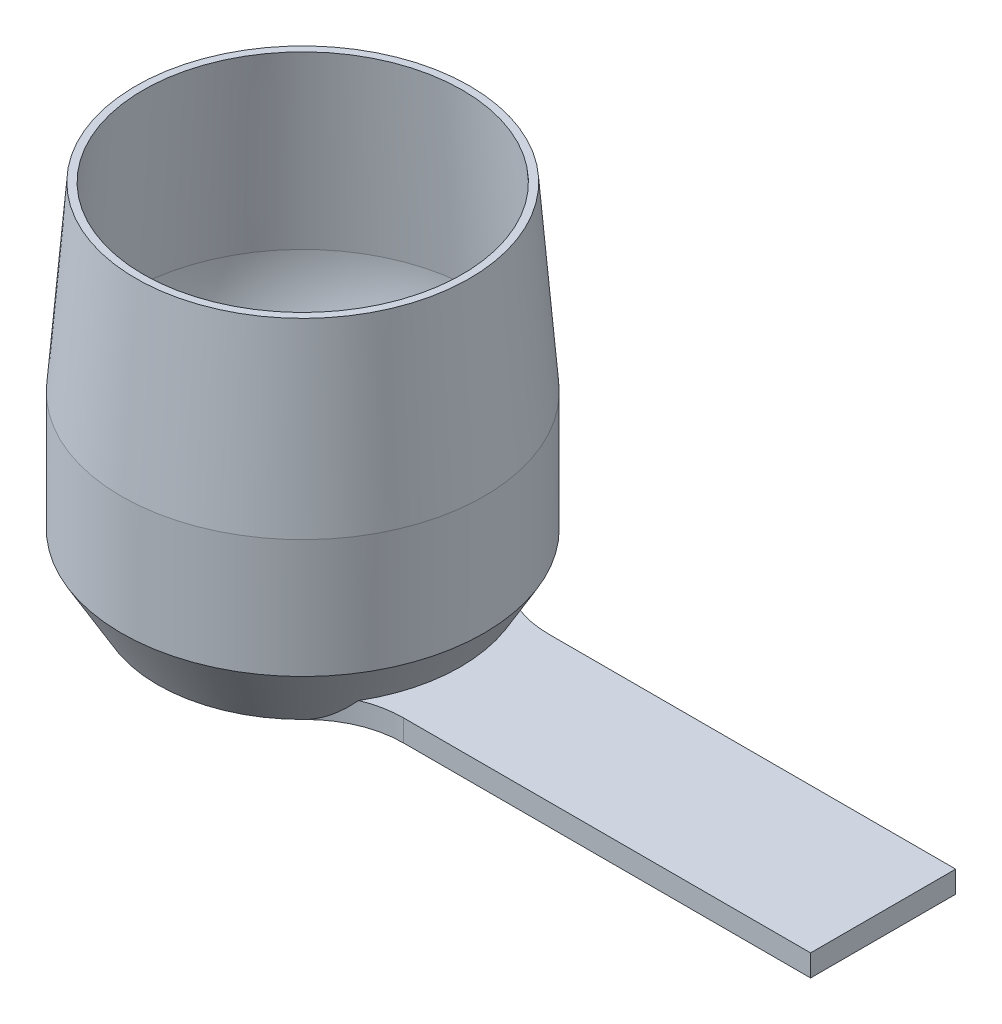
ISO-10303-21;
HEADER;
FILE_DESCRIPTION(('STEP AP214'),'2;1');
FILE_NAME('part.step','',(''),(''),'','','');
FILE_SCHEMA(('AUTOMOTIVE_DESIGN { 1 0 10303 214 1 1 1 1 }'));
ENDSEC;
DATA;
#1=APPLICATION_CONTEXT('core data for automotive mechanical design processes');
#2=APPLICATION_PROTOCOL_DEFINITION('international standard','automotive_design',2000,#1);
#3=PRODUCT_CONTEXT('',#1,'mechanical');
#4=PRODUCT('Part','Part','',(#3));
#5=PRODUCT_RELATED_PRODUCT_CATEGORY('part','',(#4));
#6=PRODUCT_DEFINITION_FORMATION('','',#4);
#7=PRODUCT_DEFINITION_CONTEXT('part definition',#1,'design');
#8=PRODUCT_DEFINITION('design','',#6,#7);
#9=PRODUCT_DEFINITION_SHAPE('','',#8);
#10=(LENGTH_UNIT() NAMED_UNIT(*) SI_UNIT(.MILLI.,.METRE.));
#11=(NAMED_UNIT(*) PLANE_ANGLE_UNIT() SI_UNIT($,.RADIAN.));
#12=(NAMED_UNIT(*) SI_UNIT($,.STERADIAN.) SOLID_ANGLE_UNIT());
#13=UNCERTAINTY_MEASURE_WITH_UNIT(LENGTH_MEASURE(1.E-05),#10,'distance_accuracy_value','');
#14=(GEOMETRIC_REPRESENTATION_CONTEXT(3) GLOBAL_UNCERTAINTY_ASSIGNED_CONTEXT((#13)) GLOBAL_UNIT_ASSIGNED_CONTEXT((#10,
#11,#12)) REPRESENTATION_CONTEXT('',''));
#15=CARTESIAN_POINT('',(0.,0.,0.));
#16=DIRECTION('',(0.,0.,1.));
#17=DIRECTION('',(1.,0.,0.));
#18=AXIS2_PLACEMENT_3D('',#15,#16,#17);
#19=CARTESIAN_POINT('',(0.,8.66025403784442,0.));
#20=DIRECTION('',(0.,1.,0.));
#21=DIRECTION('',(0.,0.,1.));
#22=AXIS2_PLACEMENT_3D('',#19,#20,#21);
#23=CONICAL_SURFACE('',#22,25.,0.523598775598293);
#24=CARTESIAN_POINT('',(0.,8.66025403784442,0.));
#25=DIRECTION('',(0.,-1.,0.));
#26=DIRECTION('',(0.,0.,-1.));
#27=AXIS2_PLACEMENT_3D('',#24,#25,#26);
#28=CIRCLE('',#27,25.);
#29=CARTESIAN_POINT('',(0.,8.66025403784442,-25.));
#30=VERTEX_POINT('',#29);
#31=EDGE_CURVE('E169',#30,#30,#28,.T.);
#32=ORIENTED_EDGE('',*,*,#31,.T.);
#33=EDGE_LOOP('',(#32));
#34=FACE_BOUND('',#33,.T.);
#35=CARTESIAN_POINT('',(14.2479954208172,8.71595514450394E-09,-14.0354774300577));
#36=CARTESIAN_POINT('',(14.3470603832759,-8.49181603127281E-05,-13.9348713921419));
#37=CARTESIAN_POINT('',(14.447699190173,0.00639791187761615,-13.8358837400323));
#38=CARTESIAN_POINT('',(14.6510195515096,0.0319027532952782,-13.6419998979872));
#39=CARTESIAN_POINT('',(14.7536977840103,0.0509057733312368,-13.547097742843));
#40=CARTESIAN_POINT('',(14.9584959429472,0.100422301150526,-13.3635456051894));
#41=CARTESIAN_POINT('',(15.0605943715549,0.130729267135595,-13.2748154450164));
#42=CARTESIAN_POINT('',(15.2652040949972,0.201916420752334,-13.1022025436112));
#43=CARTESIAN_POINT('',(15.3677155424729,0.242800955262744,-13.0183218126438));
#44=CARTESIAN_POINT('',(15.7366632335744,0.407314071284793,-12.7251814296162));
#45=CARTESIAN_POINT('',(16.0026274215411,0.558574204331746,-12.5303311778546));
#46=CARTESIAN_POINT('',(16.396121966124,0.820149419307213,-12.2619404491457));
#47=CARTESIAN_POINT('',(16.5271993813232,0.913835689481066,-12.1759858757158));
#48=CARTESIAN_POINT('',(16.7869582632256,1.11080771049582,-12.0117706774949));
#49=CARTESIAN_POINT('',(16.9156404449913,1.2140905394068,-11.9335077256204));
#50=CARTESIAN_POINT('',(17.1917989369372,1.44650480981756,-11.7715618227166));
#51=CARTESIAN_POINT('',(17.3388130125606,1.57706819687157,-11.6891667111599));
#52=CARTESIAN_POINT('',(17.6295056382277,1.84686534241842,-11.5330033090405));
#53=CARTESIAN_POINT('',(17.7731827952582,1.9861026356365,-11.4592385711737));
#54=CARTESIAN_POINT('',(18.0540608550675,2.268263270475,-11.3210725278462));
#55=CARTESIAN_POINT('',(18.1913347175783,2.41102911216921,-11.2564954399426));
#56=CARTESIAN_POINT('',(18.4628525252865,2.70187638877401,-11.1341160224797));
#57=CARTESIAN_POINT('',(18.5971000813464,2.84995087589785,-11.0763052318914));
#58=CARTESIAN_POINT('',(18.7300306462738,3.0002,-11.0214791705963));
#59=B_SPLINE_CURVE_WITH_KNOTS('',3,(#35,#36,#37,#38,#39,#40,#41,#42,#43,#44,#45,#46,#47,#48,#49,
#50,#51,#52,#53,#54,#55,#56,#57,#58),.UNSPECIFIED.,.F.,.F.,(4,2,2,2,2,2,2,2,2,2,2,4),(0.,
0.423332791912555,0.846024922137753,1.26134463996976,1.67683530635654,2.75792633754002,
3.30552926538569,3.85296600380257,4.49209640564389,5.13148898683615,5.75623490432711,
6.38019105707654),.UNSPECIFIED.);
#60=CARTESIAN_POINT('',(14.2481954208172,0.,-14.0352743916962));
#61=VERTEX_POINT('',#60);
#62=CARTESIAN_POINT('',(18.7298537496408,3.,-11.0215521057527));
#63=VERTEX_POINT('',#62);
#64=EDGE_CURVE('E56',#61,#63,#59,.T.);
#65=ORIENTED_EDGE('',*,*,#64,.F.);
#66=CARTESIAN_POINT('',(0.,0.,0.));
#67=DIRECTION('',(0.,-1.,0.));
#68=DIRECTION('',(0.,0.,-1.));
#69=AXIS2_PLACEMENT_3D('',#66,#67,#68);
#70=CIRCLE('',#69,20.);
#71=CARTESIAN_POINT('',(14.2481954208172,0.,14.0352743916962));
#72=VERTEX_POINT('',#71);
#73=EDGE_CURVE('E171',#72,#61,#70,.T.);
#74=ORIENTED_EDGE('',*,*,#73,.F.);
#75=CARTESIAN_POINT('',(18.7300306462738,3.0002,11.0214791705963));
#76=CARTESIAN_POINT('',(18.5981252554428,2.85110818797191,11.0758817657408));
#77=CARTESIAN_POINT('',(18.4649231152097,2.70415954095091,11.1332241018704));
#78=CARTESIAN_POINT('',(18.1955644684667,2.41549570428315,11.254548316667));
#79=CARTESIAN_POINT('',(18.0594048569746,2.27378648340963,11.3185374694815));
#80=CARTESIAN_POINT('',(17.780059060822,1.9928584895381,11.4557641588553));
#81=CARTESIAN_POINT('',(17.6367836779812,1.85383187450053,11.5292164746279));
#82=CARTESIAN_POINT('',(17.3468910649994,1.58436476353536,11.684710392147));
#83=CARTESIAN_POINT('',(17.2002747504877,1.45392195230774,11.7667496621489));
#84=CARTESIAN_POINT('',(16.9023506302235,1.20263641276601,11.9411509807624));
#85=CARTESIAN_POINT('',(16.7510137928907,1.08188336163659,12.0335938248859));
#86=CARTESIAN_POINT('',(16.4449599038357,0.853942682020128,12.2293088488581));
#87=CARTESIAN_POINT('',(16.2902418581488,0.746759107167846,12.3325842479677));
#88=CARTESIAN_POINT('',(15.9803533901477,0.550899329484157,12.5492619917177));
#89=CARTESIAN_POINT('',(15.8252227698569,0.461975094057687,12.6624938938837));
#90=CARTESIAN_POINT('',(15.5137262299904,0.304634129782638,12.9006501924657));
#91=CARTESIAN_POINT('',(15.3573619033827,0.236194353884589,13.0255612393593));
#92=CARTESIAN_POINT('',(15.0406086736454,0.121992977356896,13.2907861685465));
#93=CARTESIAN_POINT('',(14.8802372237823,0.0769604674071108,13.4314458883867));
#94=CARTESIAN_POINT('',(14.6416339886933,0.0311487115769662,13.6511579925583));
#95=CARTESIAN_POINT('',(14.5618742122481,0.0194976919605408,13.7264070090537));
#96=CARTESIAN_POINT('',(14.4037607083494,0.0039072981377369,13.8792664386062));
#97=CARTESIAN_POINT('',(14.3254081195904,-2.60869829588857E-05,13.9568786381646));
#98=CARTESIAN_POINT('',(14.2479954208172,8.71595347467771E-09,14.0354774300577));
#99=B_SPLINE_CURVE_WITH_KNOTS('',3,(#75,#76,#77,#78,#79,#80,#81,#82,#83,#84,#85,#86,#87,#88,#89,
#90,#91,#92,#93,#94,#95,#96,#97,#98),.UNSPECIFIED.,.F.,.F.,(4,2,2,2,2,2,2,2,2,2,2,4),(0.,
0.619144736277869,1.23897433758188,1.87682279856549,2.51449850214499,3.15752161889048,
3.80073637611384,4.43453207192583,5.06761198077841,5.71938018213442,6.04992324695928,
6.38072272053078),.UNSPECIFIED.);
#100=CARTESIAN_POINT('',(18.7298537496408,3.,11.0215521057527));
#101=VERTEX_POINT('',#100);
#102=EDGE_CURVE('E101',#101,#72,#99,.T.);
#103=ORIENTED_EDGE('',*,*,#102,.F.);
#104=CARTESIAN_POINT('',(0.,3.,0.));
#105=DIRECTION('',(0.,1.,0.));
#106=DIRECTION('',(0.,0.,1.));
#107=AXIS2_PLACEMENT_3D('',#104,#105,#106);
#108=CIRCLE('',#107,21.7320508075689);
#109=EDGE_CURVE('E11',#101,#63,#108,.T.);
#110=ORIENTED_EDGE('',*,*,#109,.T.);
#111=EDGE_LOOP('',(#65,#74,#103,#110));
#112=FACE_BOUND('',#111,.T.);
#113=ADVANCED_FACE('F33',(#34,#112),#23,.T.);
#114=CARTESIAN_POINT('',(0.,24.800826446281,0.));
#115=DIRECTION('',(0.,-1.,0.));
#116=DIRECTION('',(0.,0.,1.));
#117=AXIS2_PLACEMENT_3D('',#114,#115,#116);
#118=SPHERICAL_SURFACE('',#117,24.000826446281);
#119=CARTESIAN_POINT('',(0.,25.,0.));
#120=DIRECTION('',(0.,-1.,0.));
#121=DIRECTION('',(0.,0.,-1.));
#122=AXIS2_PLACEMENT_3D('',#119,#120,#121);
#123=CIRCLE('',#122,24.);
#124=CARTESIAN_POINT('',(0.,25.,-24.));
#125=VERTEX_POINT('',#124);
#126=EDGE_CURVE('E41',#125,#125,#123,.T.);
#127=ORIENTED_EDGE('',*,*,#126,.F.);
#128=EDGE_LOOP('',(#127));
#129=FACE_BOUND('',#128,.T.);
#130=ADVANCED_FACE('F35',(#129),#118,.F.);
#131=CARTESIAN_POINT('',(0.,25.,0.));
#132=DIRECTION('',(0.,-1.,0.));
#133=DIRECTION('',(0.,0.,-1.));
#134=AXIS2_PLACEMENT_3D('',#131,#132,#133);
#135=CONICAL_SURFACE('',#134,24.,0.0798299857122373);
#136=CARTESIAN_POINT('',(0.,50.,0.));
#137=DIRECTION('',(0.,-1.,0.));
#138=DIRECTION('',(0.,0.,-1.));
#139=AXIS2_PLACEMENT_3D('',#136,#137,#138);
#140=CIRCLE('',#139,22.);
#141=CARTESIAN_POINT('',(0.,50.,-22.));
#142=VERTEX_POINT('',#141);
#143=EDGE_CURVE('E182',#142,#142,#140,.T.);
#144=ORIENTED_EDGE('',*,*,#143,.F.);
#145=EDGE_LOOP('',(#144));
#146=FACE_BOUND('',#145,.T.);
#147=ORIENTED_EDGE('',*,*,#126,.T.);
#148=EDGE_LOOP('',(#147));
#149=FACE_BOUND('',#148,.T.);
#150=ADVANCED_FACE('F164',(#146,#149),#135,.F.);
#151=CARTESIAN_POINT('',(0.,50.,23.));
#152=DIRECTION('',(0.,-1.,0.));
#153=DIRECTION('',(0.,0.,-1.));
#154=AXIS2_PLACEMENT_3D('',#151,#152,#153);
#155=PLANE('',#154);
#156=CARTESIAN_POINT('',(0.,50.,0.));
#157=DIRECTION('',(0.,-1.,0.));
#158=DIRECTION('',(0.,0.,-1.));
#159=AXIS2_PLACEMENT_3D('',#156,#157,#158);
#160=CIRCLE('',#159,23.);
#161=CARTESIAN_POINT('',(0.,50.,-23.));
#162=VERTEX_POINT('',#161);
#163=EDGE_CURVE('E179',#162,#162,#160,.T.);
#164=ORIENTED_EDGE('',*,*,#163,.F.);
#165=EDGE_LOOP('',(#164));
#166=FACE_BOUND('',#165,.T.);
#167=ORIENTED_EDGE('',*,*,#143,.T.);
#168=EDGE_LOOP('',(#167));
#169=FACE_BOUND('',#168,.T.);
#170=ADVANCED_FACE('F188',(#166,#169),#155,.F.);
#171=CARTESIAN_POINT('',(0.,50.,0.));
#172=DIRECTION('',(0.,-1.,0.));
#173=DIRECTION('',(0.,0.,-1.));
#174=AXIS2_PLACEMENT_3D('',#171,#172,#173);
#175=CONICAL_SURFACE('',#174,23.,0.0798299857122374);
#176=CARTESIAN_POINT('',(0.,25.,0.));
#177=DIRECTION('',(0.,-1.,0.));
#178=DIRECTION('',(0.,0.,-1.));
#179=AXIS2_PLACEMENT_3D('',#176,#177,#178);
#180=CIRCLE('',#179,25.);
#181=CARTESIAN_POINT('',(0.,25.,-25.));
#182=VERTEX_POINT('',#181);
#183=EDGE_CURVE('E174',#182,#182,#180,.T.);
#184=ORIENTED_EDGE('',*,*,#183,.F.);
#185=EDGE_LOOP('',(#184));
#186=FACE_BOUND('',#185,.T.);
#187=ORIENTED_EDGE('',*,*,#163,.T.);
#188=EDGE_LOOP('',(#187));
#189=FACE_BOUND('',#188,.T.);
#190=ADVANCED_FACE('F157',(#186,#189),#175,.T.);
#191=CARTESIAN_POINT('',(0.,0.628504356956203,0.));
#192=DIRECTION('',(0.,-1.,0.));
#193=DIRECTION('',(0.,0.,-1.));
#194=AXIS2_PLACEMENT_3D('',#191,#192,#193);
#195=CYLINDRICAL_SURFACE('',#194,25.);
#196=ORIENTED_EDGE('',*,*,#31,.F.);
#197=EDGE_LOOP('',(#196));
#198=FACE_BOUND('',#197,.T.);
#199=ORIENTED_EDGE('',*,*,#183,.T.);
#200=EDGE_LOOP('',(#199));
#201=FACE_BOUND('',#200,.T.);
#202=ADVANCED_FACE('F153',(#198,#201),#195,.T.);
#203=CARTESIAN_POINT('',(0.,0.,0.));
#204=DIRECTION('',(0.,1.,0.));
#205=DIRECTION('',(0.,0.,1.));
#206=AXIS2_PLACEMENT_3D('',#203,#204,#205);
#207=PLANE('',#206);
#208=ORIENTED_EDGE('',*,*,#73,.T.);
#209=CARTESIAN_POINT('',(23.8874281173666,0.,-23.5304611031178));
#210=DIRECTION('',(0.,-1.,0.));
#211=DIRECTION('',(0.,0.,1.));
#212=AXIS2_PLACEMENT_3D('',#209,#210,#211);
#213=CIRCLE('',#212,13.5304611031178);
#214=CARTESIAN_POINT('',(23.8874281173666,0.,-10.));
#215=VERTEX_POINT('',#214);
#216=EDGE_CURVE('E115',#215,#61,#213,.T.);
#217=ORIENTED_EDGE('',*,*,#216,.F.);
#218=DIRECTION('',(-1.,0.,0.));
#219=VECTOR('',#218,1.);
#220=CARTESIAN_POINT('',(23.8874281173666,0.,-10.));
#221=LINE('',#220,#219);
#222=CARTESIAN_POINT('',(80.,0.,-10.));
#223=VERTEX_POINT('',#222);
#224=EDGE_CURVE('E122',#223,#215,#221,.T.);
#225=ORIENTED_EDGE('',*,*,#224,.F.);
#226=DIRECTION('',(0.,0.,-1.));
#227=VECTOR('',#226,1.);
#228=CARTESIAN_POINT('',(80.,0.,10.));
#229=LINE('',#228,#227);
#230=CARTESIAN_POINT('',(80.,0.,10.));
#231=VERTEX_POINT('',#230);
#232=EDGE_CURVE('E120',#231,#223,#229,.T.);
#233=ORIENTED_EDGE('',*,*,#232,.F.);
#234=DIRECTION('',(1.,0.,0.));
#235=VECTOR('',#234,1.);
#236=CARTESIAN_POINT('',(23.8874281173666,0.,10.));
#237=LINE('',#236,#235);
#238=CARTESIAN_POINT('',(23.8874281173666,0.,10.));
#239=VERTEX_POINT('',#238);
#240=EDGE_CURVE('E118',#239,#231,#237,.T.);
#241=ORIENTED_EDGE('',*,*,#240,.F.);
#242=CARTESIAN_POINT('',(23.8874281173666,0.,23.5304611031178));
#243=DIRECTION('',(0.,-1.,0.));
#244=DIRECTION('',(0.,0.,1.));
#245=AXIS2_PLACEMENT_3D('',#242,#243,#244);
#246=CIRCLE('',#245,13.5304611031178);
#247=EDGE_CURVE('E48',#72,#239,#246,.T.);
#248=ORIENTED_EDGE('',*,*,#247,.F.);
#249=EDGE_LOOP('',(#208,#217,#225,#233,#241,#248));
#250=FACE_BOUND('',#249,.T.);
#251=ADVANCED_FACE('F151',(#250),#207,.F.);
#252=CARTESIAN_POINT('',(23.8874281173666,3.,-23.5304611031178));
#253=DIRECTION('',(0.,-1.,0.));
#254=DIRECTION('',(0.,0.,-1.));
#255=AXIS2_PLACEMENT_3D('',#252,#253,#254);
#256=CYLINDRICAL_SURFACE('',#255,13.5304611031178);
#257=ORIENTED_EDGE('',*,*,#216,.T.);
#258=ORIENTED_EDGE('',*,*,#64,.T.);
#259=CARTESIAN_POINT('',(23.8874281173666,3.,-23.5304611031178));
#260=DIRECTION('',(0.,-1.,0.));
#261=DIRECTION('',(0.,0.,1.));
#262=AXIS2_PLACEMENT_3D('',#259,#260,#261);
#263=CIRCLE('',#262,13.5304611031178);
#264=CARTESIAN_POINT('',(23.8874281173666,3.,-10.));
#265=VERTEX_POINT('',#264);
#266=EDGE_CURVE('E95',#265,#63,#263,.T.);
#267=ORIENTED_EDGE('',*,*,#266,.F.);
#268=DIRECTION('',(0.,-1.,0.));
#269=VECTOR('',#268,1.);
#270=CARTESIAN_POINT('',(23.8874281173666,3.,-10.));
#271=LINE('',#270,#269);
#272=EDGE_CURVE('E114',#265,#215,#271,.T.);
#273=ORIENTED_EDGE('',*,*,#272,.T.);
#274=EDGE_LOOP('',(#257,#258,#267,#273));
#275=FACE_BOUND('',#274,.T.);
#276=ADVANCED_FACE('F147',(#275),#256,.F.);
#277=CARTESIAN_POINT('',(23.8874281173666,3.,23.5304611031178));
#278=DIRECTION('',(0.,-1.,0.));
#279=DIRECTION('',(0.,0.,-1.));
#280=AXIS2_PLACEMENT_3D('',#277,#278,#279);
#281=CYLINDRICAL_SURFACE('',#280,13.5304611031178);
#282=CARTESIAN_POINT('',(23.8874281173666,3.,23.5304611031178));
#283=DIRECTION('',(0.,-1.,0.));
#284=DIRECTION('',(0.,0.,1.));
#285=AXIS2_PLACEMENT_3D('',#282,#283,#284);
#286=CIRCLE('',#285,13.5304611031178);
#287=CARTESIAN_POINT('',(23.8874281173666,3.,10.));
#288=VERTEX_POINT('',#287);
#289=EDGE_CURVE('E87',#101,#288,#286,.T.);
#290=ORIENTED_EDGE('',*,*,#289,.F.);
#291=ORIENTED_EDGE('',*,*,#102,.T.);
#292=ORIENTED_EDGE('',*,*,#247,.T.);
#293=DIRECTION('',(0.,-1.,0.));
#294=VECTOR('',#293,1.);
#295=CARTESIAN_POINT('',(23.8874281173666,3.,10.));
#296=LINE('',#295,#294);
#297=EDGE_CURVE('E98',#288,#239,#296,.T.);
#298=ORIENTED_EDGE('',*,*,#297,.F.);
#299=EDGE_LOOP('',(#290,#291,#292,#298));
#300=FACE_BOUND('',#299,.T.);
#301=ADVANCED_FACE('F99',(#300),#281,.F.);
#302=CARTESIAN_POINT('',(23.8874281173666,3.,10.));
#303=DIRECTION('',(0.,0.,-1.));
#304=DIRECTION('',(-1.,0.,0.));
#305=AXIS2_PLACEMENT_3D('',#302,#303,#304);
#306=PLANE('',#305);
#307=ORIENTED_EDGE('',*,*,#240,.T.);
#308=DIRECTION('',(0.,-1.,0.));
#309=VECTOR('',#308,1.);
#310=CARTESIAN_POINT('',(80.,3.,10.));
#311=LINE('',#310,#309);
#312=CARTESIAN_POINT('',(80.,3.,10.));
#313=VERTEX_POINT('',#312);
#314=EDGE_CURVE('E102',#313,#231,#311,.T.);
#315=ORIENTED_EDGE('',*,*,#314,.F.);
#316=DIRECTION('',(1.,0.,0.));
#317=VECTOR('',#316,1.);
#318=CARTESIAN_POINT('',(23.8874281173666,3.,10.));
#319=LINE('',#318,#317);
#320=EDGE_CURVE('E91',#288,#313,#319,.T.);
#321=ORIENTED_EDGE('',*,*,#320,.F.);
#322=ORIENTED_EDGE('',*,*,#297,.T.);
#323=EDGE_LOOP('',(#307,#315,#321,#322));
#324=FACE_BOUND('',#323,.T.);
#325=ADVANCED_FACE('F104',(#324),#306,.F.);
#326=CARTESIAN_POINT('',(80.,3.,10.));
#327=DIRECTION('',(-1.,0.,0.));
#328=DIRECTION('',(0.,0.,1.));
#329=AXIS2_PLACEMENT_3D('',#326,#327,#328);
#330=PLANE('',#329);
#331=ORIENTED_EDGE('',*,*,#232,.T.);
#332=DIRECTION('',(0.,-1.,0.));
#333=VECTOR('',#332,1.);
#334=CARTESIAN_POINT('',(80.,3.,-10.));
#335=LINE('',#334,#333);
#336=CARTESIAN_POINT('',(80.,3.,-10.));
#337=VERTEX_POINT('',#336);
#338=EDGE_CURVE('E126',#337,#223,#335,.T.);
#339=ORIENTED_EDGE('',*,*,#338,.F.);
#340=DIRECTION('',(0.,0.,-1.));
#341=VECTOR('',#340,1.);
#342=CARTESIAN_POINT('',(80.,3.,10.));
#343=LINE('',#342,#341);
#344=EDGE_CURVE('E107',#313,#337,#343,.T.);
#345=ORIENTED_EDGE('',*,*,#344,.F.);
#346=ORIENTED_EDGE('',*,*,#314,.T.);
#347=EDGE_LOOP('',(#331,#339,#345,#346));
#348=FACE_BOUND('',#347,.T.);
#349=ADVANCED_FACE('F242',(#348),#330,.F.);
#350=CARTESIAN_POINT('',(23.8874281173666,3.,-10.));
#351=DIRECTION('',(0.,0.,1.));
#352=DIRECTION('',(1.,0.,0.));
#353=AXIS2_PLACEMENT_3D('',#350,#351,#352);
#354=PLANE('',#353);
#355=ORIENTED_EDGE('',*,*,#224,.T.);
#356=ORIENTED_EDGE('',*,*,#272,.F.);
#357=DIRECTION('',(-1.,0.,0.));
#358=VECTOR('',#357,1.);
#359=CARTESIAN_POINT('',(23.8874281173666,3.,-10.));
#360=LINE('',#359,#358);
#361=EDGE_CURVE('E109',#337,#265,#360,.T.);
#362=ORIENTED_EDGE('',*,*,#361,.F.);
#363=ORIENTED_EDGE('',*,*,#338,.T.);
#364=EDGE_LOOP('',(#355,#356,#362,#363));
#365=FACE_BOUND('',#364,.T.);
#366=ADVANCED_FACE('F250',(#365),#354,.F.);
#367=CARTESIAN_POINT('',(23.8874281173666,3.,-23.5304611031178));
#368=DIRECTION('',(0.,1.,0.));
#369=DIRECTION('',(0.,0.,1.));
#370=AXIS2_PLACEMENT_3D('',#367,#368,#369);
#371=PLANE('',#370);
#372=ORIENTED_EDGE('',*,*,#109,.F.);
#373=ORIENTED_EDGE('',*,*,#289,.T.);
#374=ORIENTED_EDGE('',*,*,#320,.T.);
#375=ORIENTED_EDGE('',*,*,#344,.T.);
#376=ORIENTED_EDGE('',*,*,#361,.T.);
#377=ORIENTED_EDGE('',*,*,#266,.T.);
#378=EDGE_LOOP('',(#372,#373,#374,#375,#376,#377));
#379=FACE_BOUND('',#378,.T.);
#380=ADVANCED_FACE('F89',(#379),#371,.T.);
#381=CLOSED_SHELL('',(#113,#130,#150,#170,#190,#202,#251,#276,#301,#325,#349,#366,#380));
#382=MANIFOLD_SOLID_BREP('B2',#381);
#383=ADVANCED_BREP_SHAPE_REPRESENTATION('',(#18,#382),#14);
#384=SHAPE_DEFINITION_REPRESENTATION(#9,#383);
ENDSEC;
END-ISO-10303-21;
